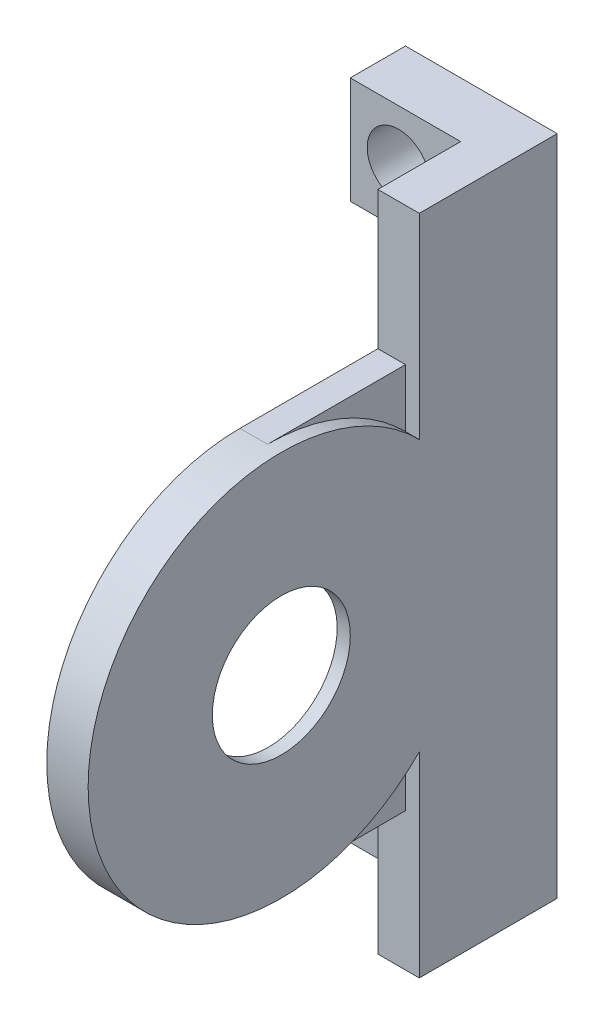
ISO-10303-21;
HEADER;
FILE_DESCRIPTION(('STEP AP214'),'2;1');
FILE_NAME('part.step','',(''),(''),'','','');
FILE_SCHEMA(('AUTOMOTIVE_DESIGN { 1 0 10303 214 1 1 1 1 }'));
ENDSEC;
DATA;
#1=APPLICATION_CONTEXT('core data for automotive mechanical design processes');
#2=APPLICATION_PROTOCOL_DEFINITION('international standard','automotive_design',2000,#1);
#3=PRODUCT_CONTEXT('',#1,'mechanical');
#4=PRODUCT('Part','Part','',(#3));
#5=PRODUCT_RELATED_PRODUCT_CATEGORY('part','',(#4));
#6=PRODUCT_DEFINITION_FORMATION('','',#4);
#7=PRODUCT_DEFINITION_CONTEXT('part definition',#1,'design');
#8=PRODUCT_DEFINITION('design','',#6,#7);
#9=PRODUCT_DEFINITION_SHAPE('','',#8);
#10=(LENGTH_UNIT() NAMED_UNIT(*) SI_UNIT(.MILLI.,.METRE.));
#11=(NAMED_UNIT(*) PLANE_ANGLE_UNIT() SI_UNIT($,.RADIAN.));
#12=(NAMED_UNIT(*) SI_UNIT($,.STERADIAN.) SOLID_ANGLE_UNIT());
#13=UNCERTAINTY_MEASURE_WITH_UNIT(LENGTH_MEASURE(1.E-05),#10,'distance_accuracy_value','');
#14=(GEOMETRIC_REPRESENTATION_CONTEXT(3) GLOBAL_UNCERTAINTY_ASSIGNED_CONTEXT((#13)) GLOBAL_UNIT_ASSIGNED_CONTEXT((#10,
#11,#12)) REPRESENTATION_CONTEXT('',''));
#15=CARTESIAN_POINT('',(0.,0.,0.));
#16=DIRECTION('',(0.,0.,1.));
#17=DIRECTION('',(1.,0.,0.));
#18=AXIS2_PLACEMENT_3D('',#15,#16,#17);
#19=CARTESIAN_POINT('',(-10.,28.,8.));
#20=DIRECTION('',(1.,0.,0.));
#21=DIRECTION('',(0.,1.,0.));
#22=AXIS2_PLACEMENT_3D('',#19,#20,#21);
#23=PLANE('',#22);
#24=DIRECTION('',(0.,-1.,0.));
#25=VECTOR('',#24,1.);
#26=CARTESIAN_POINT('',(-10.,28.,0.));
#27=LINE('',#26,#25);
#28=CARTESIAN_POINT('',(-10.,48.,0.));
#29=VERTEX_POINT('',#28);
#30=CARTESIAN_POINT('',(-10.,32.5,0.));
#31=VERTEX_POINT('',#30);
#32=EDGE_CURVE('E251',#29,#31,#27,.T.);
#33=ORIENTED_EDGE('',*,*,#32,.T.);
#34=DIRECTION('',(0.,0.,1.));
#35=VECTOR('',#34,1.);
#36=CARTESIAN_POINT('',(-10.,32.5,0.));
#37=LINE('',#36,#35);
#38=CARTESIAN_POINT('',(-10.,32.5,8.));
#39=VERTEX_POINT('',#38);
#40=EDGE_CURVE('E309',#31,#39,#37,.T.);
#41=ORIENTED_EDGE('',*,*,#40,.T.);
#42=DIRECTION('',(0.,-1.,0.));
#43=VECTOR('',#42,1.);
#44=CARTESIAN_POINT('',(-10.,28.,8.));
#45=LINE('',#44,#43);
#46=CARTESIAN_POINT('',(-10.,48.,8.));
#47=VERTEX_POINT('',#46);
#48=EDGE_CURVE('E261',#47,#39,#45,.T.);
#49=ORIENTED_EDGE('',*,*,#48,.F.);
#50=DIRECTION('',(0.,0.,1.));
#51=VECTOR('',#50,1.);
#52=CARTESIAN_POINT('',(-10.,48.,8.));
#53=LINE('',#52,#51);
#54=EDGE_CURVE('E344',#29,#47,#53,.T.);
#55=ORIENTED_EDGE('',*,*,#54,.F.);
#56=EDGE_LOOP('',(#33,#41,#49,#55));
#57=FACE_BOUND('',#56,.T.);
#58=ADVANCED_FACE('F54',(#57),#23,.F.);
#59=CARTESIAN_POINT('',(-10.,28.,8.));
#60=DIRECTION('',(0.,-1.,0.));
#61=DIRECTION('',(0.,0.,-1.));
#62=AXIS2_PLACEMENT_3D('',#59,#60,#61);
#63=PLANE('',#62);
#64=DIRECTION('',(1.,0.,0.));
#65=VECTOR('',#64,1.);
#66=CARTESIAN_POINT('',(12.,28.,20.));
#67=LINE('',#66,#65);
#68=CARTESIAN_POINT('',(5.99999999999999,28.,20.));
#69=VERTEX_POINT('',#68);
#70=CARTESIAN_POINT('',(9.99999999999999,28.,20.));
#71=VERTEX_POINT('',#70);
#72=EDGE_CURVE('E339',#69,#71,#67,.T.);
#73=ORIENTED_EDGE('',*,*,#72,.F.);
#74=DIRECTION('',(0.,0.,-1.));
#75=VECTOR('',#74,1.);
#76=CARTESIAN_POINT('',(5.99999999999999,28.,68.));
#77=LINE('',#76,#75);
#78=CARTESIAN_POINT('',(5.99999999999999,28.,40.));
#79=VERTEX_POINT('',#78);
#80=EDGE_CURVE('E252',#79,#69,#77,.T.);
#81=ORIENTED_EDGE('',*,*,#80,.F.);
#82=DIRECTION('',(-1.,0.,0.));
#83=VECTOR('',#82,1.);
#84=CARTESIAN_POINT('',(-10.,28.,40.));
#85=LINE('',#84,#83);
#86=CARTESIAN_POINT('',(9.99999999999999,28.,40.));
#87=VERTEX_POINT('',#86);
#88=EDGE_CURVE('E275',#79,#87,#85,.F.);
#89=ORIENTED_EDGE('',*,*,#88,.T.);
#90=DIRECTION('',(0.,0.,-1.));
#91=VECTOR('',#90,1.);
#92=CARTESIAN_POINT('',(9.99999999999999,28.,8.));
#93=LINE('',#92,#91);
#94=EDGE_CURVE('E265',#87,#71,#93,.T.);
#95=ORIENTED_EDGE('',*,*,#94,.T.);
#96=EDGE_LOOP('',(#73,#81,#89,#95));
#97=FACE_BOUND('',#96,.T.);
#98=ADVANCED_FACE('F559',(#97),#63,.F.);
#99=CARTESIAN_POINT('',(9.99999999999999,28.,8.));
#100=DIRECTION('',(-1.,0.,0.));
#101=DIRECTION('',(0.,-1.,0.));
#102=AXIS2_PLACEMENT_3D('',#99,#100,#101);
#103=PLANE('',#102);
#104=DIRECTION('',(0.,-1.,0.));
#105=VECTOR('',#104,1.);
#106=CARTESIAN_POINT('',(9.99999999999999,28.,20.));
#107=LINE('',#106,#105);
#108=CARTESIAN_POINT('',(9.99999999999999,19.5959179422654,20.));
#109=VERTEX_POINT('',#108);
#110=EDGE_CURVE('E375',#71,#109,#107,.T.);
#111=ORIENTED_EDGE('',*,*,#110,.F.);
#112=ORIENTED_EDGE('',*,*,#94,.F.);
#113=CARTESIAN_POINT('',(10.,0.,40.));
#114=DIRECTION('',(1.,0.,0.));
#115=DIRECTION('',(0.,1.,0.));
#116=AXIS2_PLACEMENT_3D('',#113,#114,#115);
#117=CIRCLE('',#116,28.);
#118=EDGE_CURVE('E64',#109,#87,#117,.T.);
#119=ORIENTED_EDGE('',*,*,#118,.F.);
#120=EDGE_LOOP('',(#111,#112,#119));
#121=FACE_BOUND('',#120,.T.);
#122=ADVANCED_FACE('F512',(#121),#103,.F.);
#123=CARTESIAN_POINT('',(10.,-19.5959179422654,20.));
#124=VERTEX_POINT('',#123);
#125=CARTESIAN_POINT('',(10.,-28.,20.));
#126=VERTEX_POINT('',#125);
#127=EDGE_CURVE('E290',#124,#126,#107,.T.);
#128=ORIENTED_EDGE('',*,*,#127,.F.);
#129=CARTESIAN_POINT('',(10.,-28.,40.));
#130=VERTEX_POINT('',#129);
#131=EDGE_CURVE('E12',#130,#124,#117,.T.);
#132=ORIENTED_EDGE('',*,*,#131,.F.);
#133=DIRECTION('',(0.,0.,-1.));
#134=VECTOR('',#133,1.);
#135=CARTESIAN_POINT('',(10.,-28.,8.));
#136=LINE('',#135,#134);
#137=EDGE_CURVE('E262',#130,#126,#136,.T.);
#138=ORIENTED_EDGE('',*,*,#137,.T.);
#139=EDGE_LOOP('',(#128,#132,#138));
#140=FACE_BOUND('',#139,.T.);
#141=ADVANCED_FACE('F566',(#140),#103,.F.);
#142=CARTESIAN_POINT('',(0.,0.,40.));
#143=DIRECTION('',(1.,0.,0.));
#144=DIRECTION('',(0.,0.,-1.));
#145=AXIS2_PLACEMENT_3D('',#142,#143,#144);
#146=CYLINDRICAL_SURFACE('',#145,28.);
#147=CARTESIAN_POINT('',(12.,0.,40.));
#148=DIRECTION('',(1.,0.,0.));
#149=DIRECTION('',(0.,1.,0.));
#150=AXIS2_PLACEMENT_3D('',#147,#148,#149);
#151=CIRCLE('',#150,28.);
#152=CARTESIAN_POINT('',(12.,19.5959179422654,20.));
#153=VERTEX_POINT('',#152);
#154=CARTESIAN_POINT('',(12.,-19.5959179422654,20.));
#155=VERTEX_POINT('',#154);
#156=EDGE_CURVE('E286',#153,#155,#151,.T.);
#157=ORIENTED_EDGE('',*,*,#156,.F.);
#158=DIRECTION('',(1.,0.,0.));
#159=VECTOR('',#158,1.);
#160=CARTESIAN_POINT('',(0.,19.5959179422654,20.));
#161=LINE('',#160,#159);
#162=EDGE_CURVE('E385',#153,#109,#161,.F.);
#163=ORIENTED_EDGE('',*,*,#162,.T.);
#164=ORIENTED_EDGE('',*,*,#118,.T.);
#165=ORIENTED_EDGE('',*,*,#88,.F.);
#166=CARTESIAN_POINT('',(6.,0.,40.));
#167=DIRECTION('',(1.,0.,0.));
#168=DIRECTION('',(0.,1.,0.));
#169=AXIS2_PLACEMENT_3D('',#166,#167,#168);
#170=CIRCLE('',#169,28.);
#171=CARTESIAN_POINT('',(6.,0.,68.));
#172=VERTEX_POINT('',#171);
#173=EDGE_CURVE('E272',#172,#79,#170,.F.);
#174=ORIENTED_EDGE('',*,*,#173,.F.);
#175=DIRECTION('',(1.,0.,0.));
#176=VECTOR('',#175,1.);
#177=CARTESIAN_POINT('',(0.,0.,68.));
#178=LINE('',#177,#176);
#179=CARTESIAN_POINT('',(10.,0.,68.));
#180=VERTEX_POINT('',#179);
#181=EDGE_CURVE('E282',#172,#180,#178,.T.);
#182=ORIENTED_EDGE('',*,*,#181,.T.);
#183=ORIENTED_EDGE('',*,*,#181,.F.);
#184=CARTESIAN_POINT('',(6.,0.,40.));
#185=DIRECTION('',(1.,0.,0.));
#186=DIRECTION('',(0.,1.,0.));
#187=AXIS2_PLACEMENT_3D('',#184,#185,#186);
#188=CIRCLE('',#187,28.);
#189=CARTESIAN_POINT('',(6.,-28.,40.));
#190=VERTEX_POINT('',#189);
#191=EDGE_CURVE('E269',#190,#172,#188,.F.);
#192=ORIENTED_EDGE('',*,*,#191,.F.);
#193=DIRECTION('',(1.,0.,0.));
#194=VECTOR('',#193,1.);
#195=CARTESIAN_POINT('',(-10.,-28.,40.));
#196=LINE('',#195,#194);
#197=EDGE_CURVE('E279',#130,#190,#196,.F.);
#198=ORIENTED_EDGE('',*,*,#197,.F.);
#199=ORIENTED_EDGE('',*,*,#131,.T.);
#200=DIRECTION('',(1.,0.,0.));
#201=VECTOR('',#200,1.);
#202=CARTESIAN_POINT('',(0.,-19.5959179422654,20.));
#203=LINE('',#202,#201);
#204=EDGE_CURVE('E379',#124,#155,#203,.T.);
#205=ORIENTED_EDGE('',*,*,#204,.T.);
#206=EDGE_LOOP('',(#157,#163,#164,#165,#174,#182,#183,#192,#198,#199,#205));
#207=FACE_BOUND('',#206,.T.);
#208=ADVANCED_FACE('F56',(#207),#146,.T.);
#209=CARTESIAN_POINT('',(-10.,-32.5,8.));
#210=VERTEX_POINT('',#209);
#211=CARTESIAN_POINT('',(-10.,-48.,8.));
#212=VERTEX_POINT('',#211);
#213=EDGE_CURVE('E242',#210,#212,#45,.T.);
#214=ORIENTED_EDGE('',*,*,#213,.F.);
#215=DIRECTION('',(0.,0.,1.));
#216=VECTOR('',#215,1.);
#217=CARTESIAN_POINT('',(-10.,-32.5,0.));
#218=LINE('',#217,#216);
#219=CARTESIAN_POINT('',(-10.,-32.5,0.));
#220=VERTEX_POINT('',#219);
#221=EDGE_CURVE('E228',#220,#210,#218,.T.);
#222=ORIENTED_EDGE('',*,*,#221,.F.);
#223=CARTESIAN_POINT('',(-10.,-48.,0.));
#224=VERTEX_POINT('',#223);
#225=EDGE_CURVE('E240',#220,#224,#27,.T.);
#226=ORIENTED_EDGE('',*,*,#225,.T.);
#227=DIRECTION('',(0.,0.,1.));
#228=VECTOR('',#227,1.);
#229=CARTESIAN_POINT('',(-10.,-48.,8.));
#230=LINE('',#229,#228);
#231=EDGE_CURVE('E331',#224,#212,#230,.T.);
#232=ORIENTED_EDGE('',*,*,#231,.T.);
#233=EDGE_LOOP('',(#214,#222,#226,#232));
#234=FACE_BOUND('',#233,.T.);
#235=ADVANCED_FACE('F238',(#234),#23,.F.);
#236=CARTESIAN_POINT('',(-10.,-28.,8.));
#237=DIRECTION('',(0.,1.,0.));
#238=DIRECTION('',(0.,0.,1.));
#239=AXIS2_PLACEMENT_3D('',#236,#237,#238);
#240=PLANE('',#239);
#241=DIRECTION('',(0.,0.,-1.));
#242=VECTOR('',#241,1.);
#243=CARTESIAN_POINT('',(6.,-28.,68.));
#244=LINE('',#243,#242);
#245=CARTESIAN_POINT('',(6.,-28.,20.));
#246=VERTEX_POINT('',#245);
#247=EDGE_CURVE('E80',#190,#246,#244,.T.);
#248=ORIENTED_EDGE('',*,*,#247,.T.);
#249=DIRECTION('',(1.,0.,0.));
#250=VECTOR('',#249,1.);
#251=CARTESIAN_POINT('',(12.,-28.,20.));
#252=LINE('',#251,#250);
#253=EDGE_CURVE('E301',#246,#126,#252,.T.);
#254=ORIENTED_EDGE('',*,*,#253,.T.);
#255=ORIENTED_EDGE('',*,*,#137,.F.);
#256=ORIENTED_EDGE('',*,*,#197,.T.);
#257=EDGE_LOOP('',(#248,#254,#255,#256));
#258=FACE_BOUND('',#257,.T.);
#259=ADVANCED_FACE('F486',(#258),#240,.F.);
#260=CARTESIAN_POINT('',(0.,0.,8.));
#261=DIRECTION('',(0.,0.,1.));
#262=DIRECTION('',(1.,0.,0.));
#263=AXIS2_PLACEMENT_3D('',#260,#261,#262);
#264=PLANE('',#263);
#265=DIRECTION('',(-1.,0.,0.));
#266=VECTOR('',#265,1.);
#267=CARTESIAN_POINT('',(4.99999999999998,32.5,8.));
#268=LINE('',#267,#266);
#269=CARTESIAN_POINT('',(4.99999999999998,32.5,8.));
#270=VERTEX_POINT('',#269);
#271=EDGE_CURVE('E234',#270,#39,#268,.T.);
#272=ORIENTED_EDGE('',*,*,#271,.F.);
#273=DIRECTION('',(0.,1.,0.));
#274=VECTOR('',#273,1.);
#275=CARTESIAN_POINT('',(4.99999999999998,32.5,8.));
#276=LINE('',#275,#274);
#277=CARTESIAN_POINT('',(4.99999999999999,-32.5,8.));
#278=VERTEX_POINT('',#277);
#279=EDGE_CURVE('E524',#278,#270,#276,.T.);
#280=ORIENTED_EDGE('',*,*,#279,.F.);
#281=DIRECTION('',(1.,0.,0.));
#282=VECTOR('',#281,1.);
#283=CARTESIAN_POINT('',(4.99999999999999,-32.5,8.));
#284=LINE('',#283,#282);
#285=EDGE_CURVE('E522',#210,#278,#284,.T.);
#286=ORIENTED_EDGE('',*,*,#285,.F.);
#287=ORIENTED_EDGE('',*,*,#213,.T.);
#288=DIRECTION('',(1.,0.,0.));
#289=VECTOR('',#288,1.);
#290=CARTESIAN_POINT('',(6.,-48.,8.));
#291=LINE('',#290,#289);
#292=CARTESIAN_POINT('',(6.,-48.,8.));
#293=VERTEX_POINT('',#292);
#294=EDGE_CURVE('E327',#212,#293,#291,.T.);
#295=ORIENTED_EDGE('',*,*,#294,.T.);
#296=DIRECTION('',(0.,-1.,0.));
#297=VECTOR('',#296,1.);
#298=CARTESIAN_POINT('',(5.99999999999999,28.,8.));
#299=LINE('',#298,#297);
#300=CARTESIAN_POINT('',(6.,48.,8.));
#301=VERTEX_POINT('',#300);
#302=EDGE_CURVE('E285',#301,#293,#299,.T.);
#303=ORIENTED_EDGE('',*,*,#302,.F.);
#304=DIRECTION('',(1.,0.,0.));
#305=VECTOR('',#304,1.);
#306=CARTESIAN_POINT('',(6.,48.,8.));
#307=LINE('',#306,#305);
#308=EDGE_CURVE('E348',#47,#301,#307,.T.);
#309=ORIENTED_EDGE('',*,*,#308,.F.);
#310=ORIENTED_EDGE('',*,*,#48,.T.);
#311=EDGE_LOOP('',(#272,#280,#286,#287,#295,#303,#309,#310));
#312=FACE_BOUND('',#311,.T.);
#313=CARTESIAN_POINT('',(-3.00000000000002,-40.5,8.));
#314=DIRECTION('',(0.,0.,1.));
#315=DIRECTION('',(1.,0.,0.));
#316=AXIS2_PLACEMENT_3D('',#313,#314,#315);
#317=CIRCLE('',#316,4.55);
#318=CARTESIAN_POINT('',(1.54999999999999,-40.5,8.));
#319=VERTEX_POINT('',#318);
#320=EDGE_CURVE('E295',#319,#319,#317,.T.);
#321=ORIENTED_EDGE('',*,*,#320,.F.);
#322=EDGE_LOOP('',(#321));
#323=FACE_BOUND('',#322,.T.);
#324=CARTESIAN_POINT('',(-3.00000000000002,40.5,8.));
#325=DIRECTION('',(0.,0.,1.));
#326=DIRECTION('',(1.,0.,0.));
#327=AXIS2_PLACEMENT_3D('',#324,#325,#326);
#328=CIRCLE('',#327,4.55);
#329=CARTESIAN_POINT('',(1.54999999999999,40.5,8.));
#330=VERTEX_POINT('',#329);
#331=EDGE_CURVE('E303',#330,#330,#328,.T.);
#332=ORIENTED_EDGE('',*,*,#331,.F.);
#333=EDGE_LOOP('',(#332));
#334=FACE_BOUND('',#333,.T.);
#335=ADVANCED_FACE('F519',(#312,#323,#334),#264,.T.);
#336=CARTESIAN_POINT('',(0.,0.,0.));
#337=DIRECTION('',(0.,0.,1.));
#338=DIRECTION('',(1.,0.,0.));
#339=AXIS2_PLACEMENT_3D('',#336,#337,#338);
#340=PLANE('',#339);
#341=CARTESIAN_POINT('',(-3.00000000000002,-40.5,0.));
#342=DIRECTION('',(0.,0.,1.));
#343=DIRECTION('',(1.,0.,0.));
#344=AXIS2_PLACEMENT_3D('',#341,#342,#343);
#345=CIRCLE('',#344,4.55);
#346=CARTESIAN_POINT('',(1.54999999999999,-40.5,0.));
#347=VERTEX_POINT('',#346);
#348=EDGE_CURVE('E58',#347,#347,#345,.T.);
#349=ORIENTED_EDGE('',*,*,#348,.T.);
#350=EDGE_LOOP('',(#349));
#351=FACE_BOUND('',#350,.T.);
#352=CARTESIAN_POINT('',(-3.00000000000002,40.5,0.));
#353=DIRECTION('',(0.,0.,1.));
#354=DIRECTION('',(1.,0.,0.));
#355=AXIS2_PLACEMENT_3D('',#352,#353,#354);
#356=CIRCLE('',#355,4.55);
#357=CARTESIAN_POINT('',(1.54999999999999,40.5,0.));
#358=VERTEX_POINT('',#357);
#359=EDGE_CURVE('E292',#358,#358,#356,.T.);
#360=ORIENTED_EDGE('',*,*,#359,.T.);
#361=EDGE_LOOP('',(#360));
#362=FACE_BOUND('',#361,.T.);
#363=DIRECTION('',(0.,1.,0.));
#364=VECTOR('',#363,1.);
#365=CARTESIAN_POINT('',(4.99999999999998,32.5,0.));
#366=LINE('',#365,#364);
#367=CARTESIAN_POINT('',(4.99999999999999,-32.5,0.));
#368=VERTEX_POINT('',#367);
#369=CARTESIAN_POINT('',(4.99999999999998,32.5,0.));
#370=VERTEX_POINT('',#369);
#371=EDGE_CURVE('E72',#368,#370,#366,.T.);
#372=ORIENTED_EDGE('',*,*,#371,.T.);
#373=DIRECTION('',(-1.,0.,0.));
#374=VECTOR('',#373,1.);
#375=CARTESIAN_POINT('',(4.99999999999998,32.5,0.));
#376=LINE('',#375,#374);
#377=EDGE_CURVE('E244',#370,#31,#376,.T.);
#378=ORIENTED_EDGE('',*,*,#377,.T.);
#379=ORIENTED_EDGE('',*,*,#32,.F.);
#380=DIRECTION('',(-1.,0.,0.));
#381=VECTOR('',#380,1.);
#382=CARTESIAN_POINT('',(-10.,48.,0.));
#383=LINE('',#382,#381);
#384=CARTESIAN_POINT('',(12.,48.,0.));
#385=VERTEX_POINT('',#384);
#386=EDGE_CURVE('E340',#385,#29,#383,.T.);
#387=ORIENTED_EDGE('',*,*,#386,.F.);
#388=DIRECTION('',(0.,1.,0.));
#389=VECTOR('',#388,1.);
#390=CARTESIAN_POINT('',(12.,28.,0.));
#391=LINE('',#390,#389);
#392=CARTESIAN_POINT('',(12.,-48.,0.));
#393=VERTEX_POINT('',#392);
#394=EDGE_CURVE('E371',#393,#385,#391,.T.);
#395=ORIENTED_EDGE('',*,*,#394,.F.);
#396=DIRECTION('',(-1.,0.,0.));
#397=VECTOR('',#396,1.);
#398=CARTESIAN_POINT('',(-10.,-48.,0.));
#399=LINE('',#398,#397);
#400=EDGE_CURVE('E248',#393,#224,#399,.T.);
#401=ORIENTED_EDGE('',*,*,#400,.T.);
#402=ORIENTED_EDGE('',*,*,#225,.F.);
#403=DIRECTION('',(1.,0.,0.));
#404=VECTOR('',#403,1.);
#405=CARTESIAN_POINT('',(4.99999999999999,-32.5,0.));
#406=LINE('',#405,#404);
#407=EDGE_CURVE('E224',#220,#368,#406,.T.);
#408=ORIENTED_EDGE('',*,*,#407,.T.);
#409=EDGE_LOOP('',(#372,#378,#379,#387,#395,#401,#402,#408));
#410=FACE_BOUND('',#409,.T.);
#411=ADVANCED_FACE('F246',(#351,#362,#410),#340,.F.);
#412=CARTESIAN_POINT('',(5.99999999999999,28.,68.));
#413=DIRECTION('',(1.,0.,0.));
#414=DIRECTION('',(0.,1.,0.));
#415=AXIS2_PLACEMENT_3D('',#412,#413,#414);
#416=PLANE('',#415);
#417=DIRECTION('',(0.,-1.,0.));
#418=VECTOR('',#417,1.);
#419=CARTESIAN_POINT('',(6.,0.,35.));
#420=LINE('',#419,#418);
#421=CARTESIAN_POINT('',(6.,-19.3649167310371,35.));
#422=VERTEX_POINT('',#421);
#423=CARTESIAN_POINT('',(6.,-24.,35.));
#424=VERTEX_POINT('',#423);
#425=EDGE_CURVE('E419',#422,#424,#420,.T.);
#426=ORIENTED_EDGE('',*,*,#425,.F.);
#427=CARTESIAN_POINT('',(6.,0.,40.));
#428=DIRECTION('',(-1.,0.,0.));
#429=DIRECTION('',(0.,-1.,0.));
#430=AXIS2_PLACEMENT_3D('',#427,#428,#429);
#431=CIRCLE('',#430,20.);
#432=CARTESIAN_POINT('',(5.99999999999999,19.3649167310371,35.));
#433=VERTEX_POINT('',#432);
#434=EDGE_CURVE('E389',#433,#422,#431,.T.);
#435=ORIENTED_EDGE('',*,*,#434,.F.);
#436=DIRECTION('',(0.,-1.,0.));
#437=VECTOR('',#436,1.);
#438=CARTESIAN_POINT('',(6.,0.,35.));
#439=LINE('',#438,#437);
#440=CARTESIAN_POINT('',(5.99999999999999,24.,35.));
#441=VERTEX_POINT('',#440);
#442=EDGE_CURVE('E394',#441,#433,#439,.T.);
#443=ORIENTED_EDGE('',*,*,#442,.F.);
#444=DIRECTION('',(0.,0.,1.));
#445=VECTOR('',#444,1.);
#446=CARTESIAN_POINT('',(5.99999999999999,24.,0.));
#447=LINE('',#446,#445);
#448=CARTESIAN_POINT('',(5.99999999999999,24.,45.));
#449=VERTEX_POINT('',#448);
#450=EDGE_CURVE('E436',#441,#449,#447,.T.);
#451=ORIENTED_EDGE('',*,*,#450,.T.);
#452=DIRECTION('',(0.,-1.,0.));
#453=VECTOR('',#452,1.);
#454=CARTESIAN_POINT('',(6.,0.,45.));
#455=LINE('',#454,#453);
#456=CARTESIAN_POINT('',(5.99999999999999,19.3649167310371,45.));
#457=VERTEX_POINT('',#456);
#458=EDGE_CURVE('E432',#449,#457,#455,.T.);
#459=ORIENTED_EDGE('',*,*,#458,.T.);
#460=CARTESIAN_POINT('',(6.,-19.3649167310371,45.));
#461=VERTEX_POINT('',#460);
#462=EDGE_CURVE('E420',#461,#457,#431,.T.);
#463=ORIENTED_EDGE('',*,*,#462,.F.);
#464=DIRECTION('',(0.,-1.,0.));
#465=VECTOR('',#464,1.);
#466=CARTESIAN_POINT('',(6.,0.,45.));
#467=LINE('',#466,#465);
#468=CARTESIAN_POINT('',(6.,-24.,45.));
#469=VERTEX_POINT('',#468);
#470=EDGE_CURVE('E428',#461,#469,#467,.T.);
#471=ORIENTED_EDGE('',*,*,#470,.T.);
#472=DIRECTION('',(0.,0.,1.));
#473=VECTOR('',#472,1.);
#474=CARTESIAN_POINT('',(6.,-24.,0.));
#475=LINE('',#474,#473);
#476=EDGE_CURVE('E424',#424,#469,#475,.T.);
#477=ORIENTED_EDGE('',*,*,#476,.F.);
#478=EDGE_LOOP('',(#426,#435,#443,#451,#459,#463,#471,#477));
#479=FACE_BOUND('',#478,.T.);
#480=ORIENTED_EDGE('',*,*,#191,.T.);
#481=ORIENTED_EDGE('',*,*,#173,.T.);
#482=ORIENTED_EDGE('',*,*,#80,.T.);
#483=DIRECTION('',(0.,-1.,0.));
#484=VECTOR('',#483,1.);
#485=CARTESIAN_POINT('',(5.99999999999999,48.,20.));
#486=LINE('',#485,#484);
#487=CARTESIAN_POINT('',(5.99999999999999,48.,20.));
#488=VERTEX_POINT('',#487);
#489=EDGE_CURVE('E363',#488,#69,#486,.T.);
#490=ORIENTED_EDGE('',*,*,#489,.F.);
#491=DIRECTION('',(0.,0.,1.));
#492=VECTOR('',#491,1.);
#493=CARTESIAN_POINT('',(5.99999999999999,48.,20.));
#494=LINE('',#493,#492);
#495=EDGE_CURVE('E352',#301,#488,#494,.T.);
#496=ORIENTED_EDGE('',*,*,#495,.F.);
#497=ORIENTED_EDGE('',*,*,#302,.T.);
#498=DIRECTION('',(0.,0.,1.));
#499=VECTOR('',#498,1.);
#500=CARTESIAN_POINT('',(5.99999999999999,-48.,20.));
#501=LINE('',#500,#499);
#502=CARTESIAN_POINT('',(5.99999999999999,-48.,20.));
#503=VERTEX_POINT('',#502);
#504=EDGE_CURVE('E323',#293,#503,#501,.T.);
#505=ORIENTED_EDGE('',*,*,#504,.T.);
#506=DIRECTION('',(0.,1.,0.));
#507=VECTOR('',#506,1.);
#508=CARTESIAN_POINT('',(5.99999999999999,-48.,20.));
#509=LINE('',#508,#507);
#510=EDGE_CURVE('E334',#503,#246,#509,.T.);
#511=ORIENTED_EDGE('',*,*,#510,.T.);
#512=ORIENTED_EDGE('',*,*,#247,.F.);
#513=EDGE_LOOP('',(#480,#481,#482,#490,#496,#497,#505,#511,#512));
#514=FACE_BOUND('',#513,.T.);
#515=ADVANCED_FACE('F494',(#479,#514),#416,.F.);
#516=CARTESIAN_POINT('',(12.,0.,40.));
#517=DIRECTION('',(1.,0.,0.));
#518=DIRECTION('',(0.,1.,0.));
#519=AXIS2_PLACEMENT_3D('',#516,#517,#518);
#520=PLANE('',#519);
#521=CARTESIAN_POINT('',(12.,0.,40.));
#522=DIRECTION('',(1.,0.,0.));
#523=DIRECTION('',(0.,1.,0.));
#524=AXIS2_PLACEMENT_3D('',#521,#522,#523);
#525=CIRCLE('',#524,9.99999999999999);
#526=CARTESIAN_POINT('',(12.,10.,40.));
#527=VERTEX_POINT('',#526);
#528=EDGE_CURVE('E287',#527,#527,#525,.T.);
#529=ORIENTED_EDGE('',*,*,#528,.F.);
#530=EDGE_LOOP('',(#529));
#531=FACE_BOUND('',#530,.T.);
#532=ORIENTED_EDGE('',*,*,#156,.T.);
#533=DIRECTION('',(0.,-1.,0.));
#534=VECTOR('',#533,1.);
#535=CARTESIAN_POINT('',(12.,28.,20.));
#536=LINE('',#535,#534);
#537=CARTESIAN_POINT('',(12.,-48.,20.));
#538=VERTEX_POINT('',#537);
#539=EDGE_CURVE('E374',#155,#538,#536,.T.);
#540=ORIENTED_EDGE('',*,*,#539,.T.);
#541=DIRECTION('',(0.,0.,-1.));
#542=VECTOR('',#541,1.);
#543=CARTESIAN_POINT('',(12.,-48.,0.));
#544=LINE('',#543,#542);
#545=EDGE_CURVE('E315',#538,#393,#544,.T.);
#546=ORIENTED_EDGE('',*,*,#545,.T.);
#547=ORIENTED_EDGE('',*,*,#394,.T.);
#548=DIRECTION('',(0.,0.,-1.));
#549=VECTOR('',#548,1.);
#550=CARTESIAN_POINT('',(12.,48.,0.));
#551=LINE('',#550,#549);
#552=CARTESIAN_POINT('',(12.,48.,20.));
#553=VERTEX_POINT('',#552);
#554=EDGE_CURVE('E359',#553,#385,#551,.T.);
#555=ORIENTED_EDGE('',*,*,#554,.F.);
#556=EDGE_CURVE('E376',#553,#153,#536,.T.);
#557=ORIENTED_EDGE('',*,*,#556,.T.);
#558=EDGE_LOOP('',(#532,#540,#546,#547,#555,#557));
#559=FACE_BOUND('',#558,.T.);
#560=ADVANCED_FACE('F503',(#531,#559),#520,.T.);
#561=CARTESIAN_POINT('',(10.1,0.,40.));
#562=DIRECTION('',(-1.,0.,0.));
#563=DIRECTION('',(0.,-1.,0.));
#564=AXIS2_PLACEMENT_3D('',#561,#562,#563);
#565=CYLINDRICAL_SURFACE('',#564,20.);
#566=DIRECTION('',(-1.,0.,0.));
#567=VECTOR('',#566,1.);
#568=CARTESIAN_POINT('',(10.1,-19.3649167310371,35.));
#569=LINE('',#568,#567);
#570=CARTESIAN_POINT('',(10.1,-19.3649167310371,35.));
#571=VERTEX_POINT('',#570);
#572=EDGE_CURVE('E416',#571,#422,#569,.T.);
#573=ORIENTED_EDGE('',*,*,#572,.F.);
#574=CARTESIAN_POINT('',(10.1,0.,40.));
#575=DIRECTION('',(-1.,0.,0.));
#576=DIRECTION('',(0.,-1.,0.));
#577=AXIS2_PLACEMENT_3D('',#574,#575,#576);
#578=CIRCLE('',#577,20.);
#579=CARTESIAN_POINT('',(10.1,19.3649167310371,35.));
#580=VERTEX_POINT('',#579);
#581=EDGE_CURVE('E390',#580,#571,#578,.T.);
#582=ORIENTED_EDGE('',*,*,#581,.F.);
#583=DIRECTION('',(-1.,0.,0.));
#584=VECTOR('',#583,1.);
#585=CARTESIAN_POINT('',(10.1,19.3649167310371,35.));
#586=LINE('',#585,#584);
#587=EDGE_CURVE('E443',#580,#433,#586,.T.);
#588=ORIENTED_EDGE('',*,*,#587,.T.);
#589=ORIENTED_EDGE('',*,*,#434,.T.);
#590=EDGE_LOOP('',(#573,#582,#588,#589));
#591=FACE_BOUND('',#590,.T.);
#592=ADVANCED_FACE('F582',(#591),#565,.F.);
#593=CARTESIAN_POINT('',(10.1,0.,35.));
#594=DIRECTION('',(0.,0.,-1.));
#595=DIRECTION('',(0.,1.,0.));
#596=AXIS2_PLACEMENT_3D('',#593,#594,#595);
#597=PLANE('',#596);
#598=ORIENTED_EDGE('',*,*,#442,.T.);
#599=ORIENTED_EDGE('',*,*,#587,.F.);
#600=DIRECTION('',(0.,-1.,0.));
#601=VECTOR('',#600,1.);
#602=CARTESIAN_POINT('',(10.1,0.,35.));
#603=LINE('',#602,#601);
#604=CARTESIAN_POINT('',(10.1,24.,35.));
#605=VERTEX_POINT('',#604);
#606=EDGE_CURVE('E412',#605,#580,#603,.T.);
#607=ORIENTED_EDGE('',*,*,#606,.F.);
#608=DIRECTION('',(-1.,0.,0.));
#609=VECTOR('',#608,1.);
#610=CARTESIAN_POINT('',(10.1,24.,35.));
#611=LINE('',#610,#609);
#612=EDGE_CURVE('E446',#605,#441,#611,.T.);
#613=ORIENTED_EDGE('',*,*,#612,.T.);
#614=EDGE_LOOP('',(#598,#599,#607,#613));
#615=FACE_BOUND('',#614,.T.);
#616=ADVANCED_FACE('F608',(#615),#597,.F.);
#617=CARTESIAN_POINT('',(10.1,24.,0.));
#618=DIRECTION('',(0.,-1.,0.));
#619=DIRECTION('',(1.,0.,0.));
#620=AXIS2_PLACEMENT_3D('',#617,#618,#619);
#621=PLANE('',#620);
#622=ORIENTED_EDGE('',*,*,#450,.F.);
#623=ORIENTED_EDGE('',*,*,#612,.F.);
#624=DIRECTION('',(0.,0.,1.));
#625=VECTOR('',#624,1.);
#626=CARTESIAN_POINT('',(10.1,24.,0.));
#627=LINE('',#626,#625);
#628=CARTESIAN_POINT('',(10.1,24.,45.));
#629=VERTEX_POINT('',#628);
#630=EDGE_CURVE('E409',#605,#629,#627,.T.);
#631=ORIENTED_EDGE('',*,*,#630,.T.);
#632=DIRECTION('',(-1.,0.,0.));
#633=VECTOR('',#632,1.);
#634=CARTESIAN_POINT('',(10.1,24.,45.));
#635=LINE('',#634,#633);
#636=EDGE_CURVE('E449',#629,#449,#635,.T.);
#637=ORIENTED_EDGE('',*,*,#636,.T.);
#638=EDGE_LOOP('',(#622,#623,#631,#637));
#639=FACE_BOUND('',#638,.T.);
#640=ADVANCED_FACE('F604',(#639),#621,.T.);
#641=CARTESIAN_POINT('',(10.1,0.,45.));
#642=DIRECTION('',(0.,0.,-1.));
#643=DIRECTION('',(-1.,0.,0.));
#644=AXIS2_PLACEMENT_3D('',#641,#642,#643);
#645=PLANE('',#644);
#646=ORIENTED_EDGE('',*,*,#458,.F.);
#647=ORIENTED_EDGE('',*,*,#636,.F.);
#648=DIRECTION('',(0.,-1.,0.));
#649=VECTOR('',#648,1.);
#650=CARTESIAN_POINT('',(10.1,0.,45.));
#651=LINE('',#650,#649);
#652=CARTESIAN_POINT('',(10.1,19.3649167310371,45.));
#653=VERTEX_POINT('',#652);
#654=EDGE_CURVE('E406',#629,#653,#651,.T.);
#655=ORIENTED_EDGE('',*,*,#654,.T.);
#656=DIRECTION('',(-1.,0.,0.));
#657=VECTOR('',#656,1.);
#658=CARTESIAN_POINT('',(10.1,19.3649167310371,45.));
#659=LINE('',#658,#657);
#660=EDGE_CURVE('E452',#653,#457,#659,.T.);
#661=ORIENTED_EDGE('',*,*,#660,.T.);
#662=EDGE_LOOP('',(#646,#647,#655,#661));
#663=FACE_BOUND('',#662,.T.);
#664=ADVANCED_FACE('F600',(#663),#645,.T.);
#665=ORIENTED_EDGE('',*,*,#462,.T.);
#666=ORIENTED_EDGE('',*,*,#660,.F.);
#667=CARTESIAN_POINT('',(10.1,-19.3649167310371,45.));
#668=VERTEX_POINT('',#667);
#669=EDGE_CURVE('E395',#668,#653,#578,.T.);
#670=ORIENTED_EDGE('',*,*,#669,.F.);
#671=DIRECTION('',(-1.,0.,0.));
#672=VECTOR('',#671,1.);
#673=CARTESIAN_POINT('',(10.1,-19.3649167310371,45.));
#674=LINE('',#673,#672);
#675=EDGE_CURVE('E455',#668,#461,#674,.T.);
#676=ORIENTED_EDGE('',*,*,#675,.T.);
#677=EDGE_LOOP('',(#665,#666,#670,#676));
#678=FACE_BOUND('',#677,.T.);
#679=ADVANCED_FACE('F596',(#678),#565,.F.);
#680=CARTESIAN_POINT('',(10.1,0.,45.));
#681=DIRECTION('',(0.,0.,-1.));
#682=DIRECTION('',(-1.,0.,0.));
#683=AXIS2_PLACEMENT_3D('',#680,#681,#682);
#684=PLANE('',#683);
#685=ORIENTED_EDGE('',*,*,#470,.F.);
#686=ORIENTED_EDGE('',*,*,#675,.F.);
#687=DIRECTION('',(0.,-1.,0.));
#688=VECTOR('',#687,1.);
#689=CARTESIAN_POINT('',(10.1,0.,45.));
#690=LINE('',#689,#688);
#691=CARTESIAN_POINT('',(10.1,-24.,45.));
#692=VERTEX_POINT('',#691);
#693=EDGE_CURVE('E403',#668,#692,#690,.T.);
#694=ORIENTED_EDGE('',*,*,#693,.T.);
#695=DIRECTION('',(-1.,0.,0.));
#696=VECTOR('',#695,1.);
#697=CARTESIAN_POINT('',(10.1,-24.,45.));
#698=LINE('',#697,#696);
#699=EDGE_CURVE('E458',#692,#469,#698,.T.);
#700=ORIENTED_EDGE('',*,*,#699,.T.);
#701=EDGE_LOOP('',(#685,#686,#694,#700));
#702=FACE_BOUND('',#701,.T.);
#703=ADVANCED_FACE('F592',(#702),#684,.T.);
#704=CARTESIAN_POINT('',(10.1,-24.,0.));
#705=DIRECTION('',(0.,-1.,0.));
#706=DIRECTION('',(1.,0.,0.));
#707=AXIS2_PLACEMENT_3D('',#704,#705,#706);
#708=PLANE('',#707);
#709=ORIENTED_EDGE('',*,*,#476,.T.);
#710=ORIENTED_EDGE('',*,*,#699,.F.);
#711=DIRECTION('',(0.,0.,1.));
#712=VECTOR('',#711,1.);
#713=CARTESIAN_POINT('',(10.1,-24.,0.));
#714=LINE('',#713,#712);
#715=CARTESIAN_POINT('',(10.1,-24.,35.));
#716=VERTEX_POINT('',#715);
#717=EDGE_CURVE('E399',#716,#692,#714,.T.);
#718=ORIENTED_EDGE('',*,*,#717,.F.);
#719=DIRECTION('',(-1.,0.,0.));
#720=VECTOR('',#719,1.);
#721=CARTESIAN_POINT('',(10.1,-24.,35.));
#722=LINE('',#721,#720);
#723=EDGE_CURVE('E461',#716,#424,#722,.T.);
#724=ORIENTED_EDGE('',*,*,#723,.T.);
#725=EDGE_LOOP('',(#709,#710,#718,#724));
#726=FACE_BOUND('',#725,.T.);
#727=ADVANCED_FACE('F588',(#726),#708,.F.);
#728=CARTESIAN_POINT('',(10.1,0.,35.));
#729=DIRECTION('',(0.,0.,-1.));
#730=DIRECTION('',(0.,1.,0.));
#731=AXIS2_PLACEMENT_3D('',#728,#729,#730);
#732=PLANE('',#731);
#733=ORIENTED_EDGE('',*,*,#425,.T.);
#734=ORIENTED_EDGE('',*,*,#723,.F.);
#735=DIRECTION('',(0.,-1.,0.));
#736=VECTOR('',#735,1.);
#737=CARTESIAN_POINT('',(10.1,0.,35.));
#738=LINE('',#737,#736);
#739=EDGE_CURVE('E393',#571,#716,#738,.T.);
#740=ORIENTED_EDGE('',*,*,#739,.F.);
#741=ORIENTED_EDGE('',*,*,#572,.T.);
#742=EDGE_LOOP('',(#733,#734,#740,#741));
#743=FACE_BOUND('',#742,.T.);
#744=ADVANCED_FACE('F584',(#743),#732,.F.);
#745=CARTESIAN_POINT('',(10.1,0.,0.));
#746=DIRECTION('',(-1.,0.,0.));
#747=DIRECTION('',(0.,-1.,0.));
#748=AXIS2_PLACEMENT_3D('',#745,#746,#747);
#749=PLANE('',#748);
#750=CARTESIAN_POINT('',(10.1,0.,40.));
#751=DIRECTION('',(-1.,0.,0.));
#752=DIRECTION('',(0.,-1.,0.));
#753=AXIS2_PLACEMENT_3D('',#750,#751,#752);
#754=CIRCLE('',#753,9.99999999999999);
#755=CARTESIAN_POINT('',(10.1,-9.99999999999999,40.));
#756=VERTEX_POINT('',#755);
#757=EDGE_CURVE('E291',#756,#756,#754,.T.);
#758=ORIENTED_EDGE('',*,*,#757,.F.);
#759=EDGE_LOOP('',(#758));
#760=FACE_BOUND('',#759,.T.);
#761=ORIENTED_EDGE('',*,*,#581,.T.);
#762=ORIENTED_EDGE('',*,*,#739,.T.);
#763=ORIENTED_EDGE('',*,*,#717,.T.);
#764=ORIENTED_EDGE('',*,*,#693,.F.);
#765=ORIENTED_EDGE('',*,*,#669,.T.);
#766=ORIENTED_EDGE('',*,*,#654,.F.);
#767=ORIENTED_EDGE('',*,*,#630,.F.);
#768=ORIENTED_EDGE('',*,*,#606,.T.);
#769=EDGE_LOOP('',(#761,#762,#763,#764,#765,#766,#767,#768));
#770=FACE_BOUND('',#769,.T.);
#771=ADVANCED_FACE('F587',(#760,#770),#749,.T.);
#772=CARTESIAN_POINT('',(12.,28.,20.));
#773=DIRECTION('',(0.,0.,-1.));
#774=DIRECTION('',(0.,1.,0.));
#775=AXIS2_PLACEMENT_3D('',#772,#773,#774);
#776=PLANE('',#775);
#777=ORIENTED_EDGE('',*,*,#162,.F.);
#778=ORIENTED_EDGE('',*,*,#556,.F.);
#779=DIRECTION('',(1.,0.,0.));
#780=VECTOR('',#779,1.);
#781=CARTESIAN_POINT('',(12.,48.,20.));
#782=LINE('',#781,#780);
#783=EDGE_CURVE('E355',#488,#553,#782,.T.);
#784=ORIENTED_EDGE('',*,*,#783,.F.);
#785=ORIENTED_EDGE('',*,*,#489,.T.);
#786=ORIENTED_EDGE('',*,*,#72,.T.);
#787=ORIENTED_EDGE('',*,*,#110,.T.);
#788=EDGE_LOOP('',(#777,#778,#784,#785,#786,#787));
#789=FACE_BOUND('',#788,.T.);
#790=ADVANCED_FACE('F554',(#789),#776,.F.);
#791=ORIENTED_EDGE('',*,*,#204,.F.);
#792=ORIENTED_EDGE('',*,*,#127,.T.);
#793=ORIENTED_EDGE('',*,*,#253,.F.);
#794=ORIENTED_EDGE('',*,*,#510,.F.);
#795=DIRECTION('',(1.,0.,0.));
#796=VECTOR('',#795,1.);
#797=CARTESIAN_POINT('',(12.,-48.,20.));
#798=LINE('',#797,#796);
#799=EDGE_CURVE('E319',#503,#538,#798,.T.);
#800=ORIENTED_EDGE('',*,*,#799,.T.);
#801=ORIENTED_EDGE('',*,*,#539,.F.);
#802=EDGE_LOOP('',(#791,#792,#793,#794,#800,#801));
#803=FACE_BOUND('',#802,.T.);
#804=ADVANCED_FACE('F483',(#803),#776,.F.);
#805=CARTESIAN_POINT('',(12.1,0.,40.));
#806=DIRECTION('',(-1.,0.,0.));
#807=DIRECTION('',(0.,-1.,0.));
#808=AXIS2_PLACEMENT_3D('',#805,#806,#807);
#809=CYLINDRICAL_SURFACE('',#808,9.99999999999999);
#810=ORIENTED_EDGE('',*,*,#528,.T.);
#811=EDGE_LOOP('',(#810));
#812=FACE_BOUND('',#811,.T.);
#813=ORIENTED_EDGE('',*,*,#757,.T.);
#814=EDGE_LOOP('',(#813));
#815=FACE_BOUND('',#814,.T.);
#816=ADVANCED_FACE('F618',(#812,#815),#809,.F.);
#817=CARTESIAN_POINT('',(0.,48.,0.));
#818=DIRECTION('',(0.,-1.,0.));
#819=DIRECTION('',(0.,0.,-1.));
#820=AXIS2_PLACEMENT_3D('',#817,#818,#819);
#821=PLANE('',#820);
#822=ORIENTED_EDGE('',*,*,#386,.T.);
#823=ORIENTED_EDGE('',*,*,#54,.T.);
#824=ORIENTED_EDGE('',*,*,#308,.T.);
#825=ORIENTED_EDGE('',*,*,#495,.T.);
#826=ORIENTED_EDGE('',*,*,#783,.T.);
#827=ORIENTED_EDGE('',*,*,#554,.T.);
#828=EDGE_LOOP('',(#822,#823,#824,#825,#826,#827));
#829=FACE_BOUND('',#828,.T.);
#830=ADVANCED_FACE('F552',(#829),#821,.F.);
#831=CARTESIAN_POINT('',(0.,-48.,0.));
#832=DIRECTION('',(0.,1.,0.));
#833=DIRECTION('',(0.,0.,-1.));
#834=AXIS2_PLACEMENT_3D('',#831,#832,#833);
#835=PLANE('',#834);
#836=ORIENTED_EDGE('',*,*,#400,.F.);
#837=ORIENTED_EDGE('',*,*,#545,.F.);
#838=ORIENTED_EDGE('',*,*,#799,.F.);
#839=ORIENTED_EDGE('',*,*,#504,.F.);
#840=ORIENTED_EDGE('',*,*,#294,.F.);
#841=ORIENTED_EDGE('',*,*,#231,.F.);
#842=EDGE_LOOP('',(#836,#837,#838,#839,#840,#841));
#843=FACE_BOUND('',#842,.T.);
#844=ADVANCED_FACE('F500',(#843),#835,.F.);
#845=CARTESIAN_POINT('',(-3.00000000000002,40.5,-52.));
#846=DIRECTION('',(0.,0.,1.));
#847=DIRECTION('',(1.,0.,0.));
#848=AXIS2_PLACEMENT_3D('',#845,#846,#847);
#849=CYLINDRICAL_SURFACE('',#848,4.55);
#850=ORIENTED_EDGE('',*,*,#331,.T.);
#851=EDGE_LOOP('',(#850));
#852=FACE_BOUND('',#851,.T.);
#853=ORIENTED_EDGE('',*,*,#359,.F.);
#854=EDGE_LOOP('',(#853));
#855=FACE_BOUND('',#854,.T.);
#856=ADVANCED_FACE('F626',(#852,#855),#849,.F.);
#857=CARTESIAN_POINT('',(-3.00000000000002,-40.5,-52.));
#858=DIRECTION('',(0.,0.,1.));
#859=DIRECTION('',(1.,0.,0.));
#860=AXIS2_PLACEMENT_3D('',#857,#858,#859);
#861=CYLINDRICAL_SURFACE('',#860,4.55);
#862=ORIENTED_EDGE('',*,*,#320,.T.);
#863=EDGE_LOOP('',(#862));
#864=FACE_BOUND('',#863,.T.);
#865=ORIENTED_EDGE('',*,*,#348,.F.);
#866=EDGE_LOOP('',(#865));
#867=FACE_BOUND('',#866,.T.);
#868=ADVANCED_FACE('F629',(#864,#867),#861,.F.);
#869=CARTESIAN_POINT('',(4.99999999999998,32.5,0.));
#870=DIRECTION('',(0.,1.,0.));
#871=DIRECTION('',(0.,0.,1.));
#872=AXIS2_PLACEMENT_3D('',#869,#870,#871);
#873=PLANE('',#872);
#874=ORIENTED_EDGE('',*,*,#271,.T.);
#875=ORIENTED_EDGE('',*,*,#40,.F.);
#876=ORIENTED_EDGE('',*,*,#377,.F.);
#877=DIRECTION('',(0.,0.,1.));
#878=VECTOR('',#877,1.);
#879=CARTESIAN_POINT('',(4.99999999999998,32.5,0.));
#880=LINE('',#879,#878);
#881=EDGE_CURVE('E537',#370,#270,#880,.T.);
#882=ORIENTED_EDGE('',*,*,#881,.T.);
#883=EDGE_LOOP('',(#874,#875,#876,#882));
#884=FACE_BOUND('',#883,.T.);
#885=ADVANCED_FACE('F544',(#884),#873,.F.);
#886=CARTESIAN_POINT('',(4.99999999999998,32.5,0.));
#887=DIRECTION('',(1.,0.,0.));
#888=DIRECTION('',(0.,1.,0.));
#889=AXIS2_PLACEMENT_3D('',#886,#887,#888);
#890=PLANE('',#889);
#891=ORIENTED_EDGE('',*,*,#279,.T.);
#892=ORIENTED_EDGE('',*,*,#881,.F.);
#893=ORIENTED_EDGE('',*,*,#371,.F.);
#894=DIRECTION('',(0.,0.,1.));
#895=VECTOR('',#894,1.);
#896=CARTESIAN_POINT('',(4.99999999999999,-32.5,0.));
#897=LINE('',#896,#895);
#898=EDGE_CURVE('E230',#368,#278,#897,.T.);
#899=ORIENTED_EDGE('',*,*,#898,.T.);
#900=EDGE_LOOP('',(#891,#892,#893,#899));
#901=FACE_BOUND('',#900,.T.);
#902=ADVANCED_FACE('F540',(#901),#890,.F.);
#903=CARTESIAN_POINT('',(4.99999999999999,-32.5,0.));
#904=DIRECTION('',(0.,-1.,0.));
#905=DIRECTION('',(1.,0.,0.));
#906=AXIS2_PLACEMENT_3D('',#903,#904,#905);
#907=PLANE('',#906);
#908=ORIENTED_EDGE('',*,*,#285,.T.);
#909=ORIENTED_EDGE('',*,*,#898,.F.);
#910=ORIENTED_EDGE('',*,*,#407,.F.);
#911=ORIENTED_EDGE('',*,*,#221,.T.);
#912=EDGE_LOOP('',(#908,#909,#910,#911));
#913=FACE_BOUND('',#912,.T.);
#914=ADVANCED_FACE('F227',(#913),#907,.F.);
#915=CLOSED_SHELL('',(#58,#98,#122,#141,#208,#235,#259,#335,#411,#515,#560,#592,#616,#640,#664,
#679,#703,#727,#744,#771,#790,#804,#816,#830,#844,#856,#868,#885,#902,#914));
#916=MANIFOLD_SOLID_BREP('B2',#915);
#917=ADVANCED_BREP_SHAPE_REPRESENTATION('',(#18,#916),#14);
#918=SHAPE_DEFINITION_REPRESENTATION(#9,#917);
ENDSEC;
END-ISO-10303-21;
